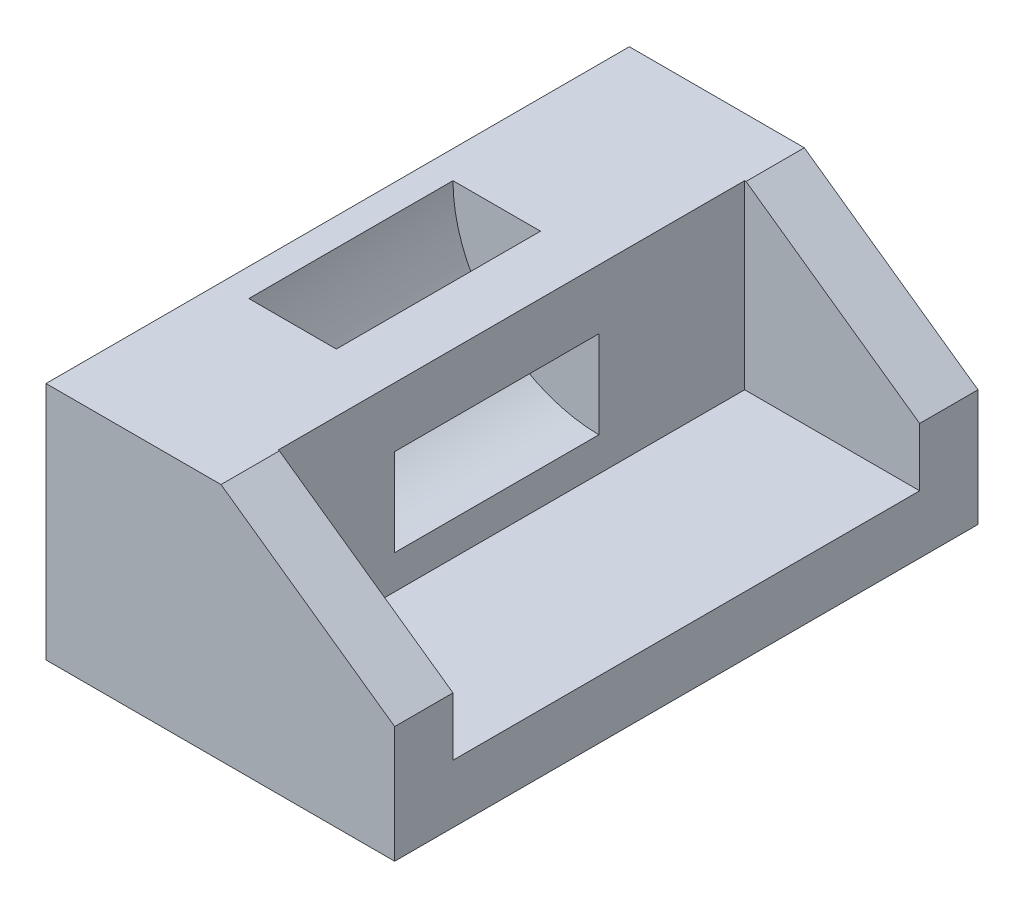
ISO-10303-21;
HEADER;
FILE_DESCRIPTION(('STEP AP214'),'2;1');
FILE_NAME('part.step','',(''),(''),'','','');
FILE_SCHEMA(('AUTOMOTIVE_DESIGN { 1 0 10303 214 1 1 1 1 }'));
ENDSEC;
DATA;
#1=APPLICATION_CONTEXT('core data for automotive mechanical design processes');
#2=APPLICATION_PROTOCOL_DEFINITION('international standard','automotive_design',2000,#1);
#3=PRODUCT_CONTEXT('',#1,'mechanical');
#4=PRODUCT('Part','Part','',(#3));
#5=PRODUCT_RELATED_PRODUCT_CATEGORY('part','',(#4));
#6=PRODUCT_DEFINITION_FORMATION('','',#4);
#7=PRODUCT_DEFINITION_CONTEXT('part definition',#1,'design');
#8=PRODUCT_DEFINITION('design','',#6,#7);
#9=PRODUCT_DEFINITION_SHAPE('','',#8);
#10=(LENGTH_UNIT() NAMED_UNIT(*) SI_UNIT(.MILLI.,.METRE.));
#11=(NAMED_UNIT(*) PLANE_ANGLE_UNIT() SI_UNIT($,.RADIAN.));
#12=(NAMED_UNIT(*) SI_UNIT($,.STERADIAN.) SOLID_ANGLE_UNIT());
#13=UNCERTAINTY_MEASURE_WITH_UNIT(LENGTH_MEASURE(1.E-05),#10,'distance_accuracy_value','');
#14=(GEOMETRIC_REPRESENTATION_CONTEXT(3) GLOBAL_UNCERTAINTY_ASSIGNED_CONTEXT((#13)) GLOBAL_UNIT_ASSIGNED_CONTEXT((#10,
#11,#12)) REPRESENTATION_CONTEXT('',''));
#15=CARTESIAN_POINT('',(0.,0.,0.));
#16=DIRECTION('',(0.,0.,1.));
#17=DIRECTION('',(1.,0.,0.));
#18=AXIS2_PLACEMENT_3D('',#15,#16,#17);
#19=CARTESIAN_POINT('',(0.,20.5223884413758,50.));
#20=DIRECTION('',(0.,-1.,0.));
#21=DIRECTION('',(0.,0.,-1.));
#22=AXIS2_PLACEMENT_3D('',#19,#20,#21);
#23=PLANE('',#22);
#24=DIRECTION('',(0.,0.,-1.));
#25=VECTOR('',#24,1.);
#26=CARTESIAN_POINT('',(15.,20.5223884413758,50.));
#27=LINE('',#26,#25);
#28=CARTESIAN_POINT('',(15.,20.5223884413758,50.));
#29=VERTEX_POINT('',#28);
#30=CARTESIAN_POINT('',(15.,20.5223884413758,45.));
#31=VERTEX_POINT('',#30);
#32=EDGE_CURVE('E260',#29,#31,#27,.T.);
#33=ORIENTED_EDGE('',*,*,#32,.T.);
#34=DIRECTION('',(1.,0.,0.));
#35=VECTOR('',#34,1.);
#36=CARTESIAN_POINT('',(14.8851370851371,20.5223884413758,45.));
#37=LINE('',#36,#35);
#38=CARTESIAN_POINT('',(14.8851370851371,20.5223884413758,45.));
#39=VERTEX_POINT('',#38);
#40=EDGE_CURVE('E196',#39,#31,#37,.T.);
#41=ORIENTED_EDGE('',*,*,#40,.F.);
#42=DIRECTION('',(0.,0.,1.));
#43=VECTOR('',#42,1.);
#44=CARTESIAN_POINT('',(14.8851370851371,20.5223884413758,45.));
#45=LINE('',#44,#43);
#46=CARTESIAN_POINT('',(14.8851370851371,20.5223884413758,5.));
#47=VERTEX_POINT('',#46);
#48=EDGE_CURVE('E183',#47,#39,#45,.T.);
#49=ORIENTED_EDGE('',*,*,#48,.F.);
#50=DIRECTION('',(1.,0.,0.));
#51=VECTOR('',#50,1.);
#52=CARTESIAN_POINT('',(14.8851370851371,20.5223884413758,5.));
#53=LINE('',#52,#51);
#54=CARTESIAN_POINT('',(15.,20.5223884413758,5.));
#55=VERTEX_POINT('',#54);
#56=EDGE_CURVE('E200',#47,#55,#53,.T.);
#57=ORIENTED_EDGE('',*,*,#56,.T.);
#58=CARTESIAN_POINT('',(15.,20.5223884413758,0.));
#59=VERTEX_POINT('',#58);
#60=EDGE_CURVE('E259',#55,#59,#27,.T.);
#61=ORIENTED_EDGE('',*,*,#60,.T.);
#62=DIRECTION('',(-1.,0.,0.));
#63=VECTOR('',#62,1.);
#64=CARTESIAN_POINT('',(0.,20.5223884413758,0.));
#65=LINE('',#64,#63);
#66=CARTESIAN_POINT('',(0.,20.5223884413758,0.));
#67=VERTEX_POINT('',#66);
#68=EDGE_CURVE('E247',#59,#67,#65,.T.);
#69=ORIENTED_EDGE('',*,*,#68,.T.);
#70=DIRECTION('',(0.,0.,-1.));
#71=VECTOR('',#70,1.);
#72=CARTESIAN_POINT('',(0.,20.5223884413758,50.));
#73=LINE('',#72,#71);
#74=CARTESIAN_POINT('',(0.,20.5223884413758,50.));
#75=VERTEX_POINT('',#74);
#76=EDGE_CURVE('E255',#75,#67,#73,.T.);
#77=ORIENTED_EDGE('',*,*,#76,.F.);
#78=DIRECTION('',(-1.,0.,0.));
#79=VECTOR('',#78,1.);
#80=CARTESIAN_POINT('',(0.,20.5223884413758,50.));
#81=LINE('',#80,#79);
#82=EDGE_CURVE('E229',#29,#75,#81,.T.);
#83=ORIENTED_EDGE('',*,*,#82,.F.);
#84=EDGE_LOOP('',(#33,#41,#49,#57,#61,#69,#77,#83));
#85=FACE_BOUND('',#84,.T.);
#86=DIRECTION('',(0.,0.,1.));
#87=VECTOR('',#86,1.);
#88=CARTESIAN_POINT('',(2.38513708513708,20.5223884413758,50.));
#89=LINE('',#88,#87);
#90=CARTESIAN_POINT('',(2.38513708513708,20.5223884413758,17.5));
#91=VERTEX_POINT('',#90);
#92=CARTESIAN_POINT('',(2.38513708513708,20.5223884413758,35.));
#93=VERTEX_POINT('',#92);
#94=EDGE_CURVE('E164',#91,#93,#89,.T.);
#95=ORIENTED_EDGE('',*,*,#94,.F.);
#96=DIRECTION('',(-1.,0.,0.));
#97=VECTOR('',#96,1.);
#98=CARTESIAN_POINT('',(0.,20.5223884413758,17.5));
#99=LINE('',#98,#97);
#100=CARTESIAN_POINT('',(9.88513708513708,20.5223884413758,17.5));
#101=VERTEX_POINT('',#100);
#102=EDGE_CURVE('E160',#101,#91,#99,.T.);
#103=ORIENTED_EDGE('',*,*,#102,.F.);
#104=DIRECTION('',(0.,0.,1.));
#105=VECTOR('',#104,1.);
#106=CARTESIAN_POINT('',(9.88513708513708,20.5223884413758,50.));
#107=LINE('',#106,#105);
#108=CARTESIAN_POINT('',(9.88513708513708,20.5223884413758,35.));
#109=VERTEX_POINT('',#108);
#110=EDGE_CURVE('E146',#109,#101,#107,.F.);
#111=ORIENTED_EDGE('',*,*,#110,.F.);
#112=DIRECTION('',(1.,0.,0.));
#113=VECTOR('',#112,1.);
#114=CARTESIAN_POINT('',(0.,20.5223884413758,35.));
#115=LINE('',#114,#113);
#116=EDGE_CURVE('E140',#93,#109,#115,.T.);
#117=ORIENTED_EDGE('',*,*,#116,.F.);
#118=EDGE_LOOP('',(#95,#103,#111,#117));
#119=FACE_BOUND('',#118,.T.);
#120=ADVANCED_FACE('F41',(#85,#119),#23,.F.);
#121=CARTESIAN_POINT('',(14.8851370851371,0.,0.));
#122=DIRECTION('',(1.,0.,0.));
#123=DIRECTION('',(0.,0.,-1.));
#124=AXIS2_PLACEMENT_3D('',#121,#122,#123);
#125=PLANE('',#124);
#126=DIRECTION('',(0.,-1.,0.));
#127=VECTOR('',#126,1.);
#128=CARTESIAN_POINT('',(14.8851370851371,20.5223884413758,45.));
#129=LINE('',#128,#127);
#130=CARTESIAN_POINT('',(14.8851370851371,5.,45.));
#131=VERTEX_POINT('',#130);
#132=EDGE_CURVE('E171',#39,#131,#129,.T.);
#133=ORIENTED_EDGE('',*,*,#132,.T.);
#134=DIRECTION('',(0.,0.,-1.));
#135=VECTOR('',#134,1.);
#136=CARTESIAN_POINT('',(14.8851370851371,5.,45.));
#137=LINE('',#136,#135);
#138=CARTESIAN_POINT('',(14.8851370851371,5.,5.));
#139=VERTEX_POINT('',#138);
#140=EDGE_CURVE('E175',#131,#139,#137,.T.);
#141=ORIENTED_EDGE('',*,*,#140,.T.);
#142=DIRECTION('',(0.,1.,0.));
#143=VECTOR('',#142,1.);
#144=CARTESIAN_POINT('',(14.8851370851371,20.5223884413758,5.));
#145=LINE('',#144,#143);
#146=EDGE_CURVE('E180',#139,#47,#145,.T.);
#147=ORIENTED_EDGE('',*,*,#146,.T.);
#148=ORIENTED_EDGE('',*,*,#48,.T.);
#149=EDGE_LOOP('',(#133,#141,#147,#148));
#150=FACE_BOUND('',#149,.T.);
#151=DIRECTION('',(0.,-1.,0.));
#152=VECTOR('',#151,1.);
#153=CARTESIAN_POINT('',(14.8851370851371,0.,17.5));
#154=LINE('',#153,#152);
#155=CARTESIAN_POINT('',(14.8851370851371,15.4088154098616,17.5));
#156=VERTEX_POINT('',#155);
#157=CARTESIAN_POINT('',(14.8851370851371,7.90804847165985,17.5));
#158=VERTEX_POINT('',#157);
#159=EDGE_CURVE('E50',#156,#158,#154,.T.);
#160=ORIENTED_EDGE('',*,*,#159,.T.);
#161=DIRECTION('',(0.,0.,1.));
#162=VECTOR('',#161,1.);
#163=CARTESIAN_POINT('',(14.8851370851371,7.90804847165985,50.));
#164=LINE('',#163,#162);
#165=CARTESIAN_POINT('',(14.8851370851371,7.90804847165985,35.));
#166=VERTEX_POINT('',#165);
#167=EDGE_CURVE('E11',#158,#166,#164,.T.);
#168=ORIENTED_EDGE('',*,*,#167,.T.);
#169=DIRECTION('',(0.,1.,0.));
#170=VECTOR('',#169,1.);
#171=CARTESIAN_POINT('',(14.8851370851371,0.,35.));
#172=LINE('',#171,#170);
#173=CARTESIAN_POINT('',(14.8851370851371,15.4088154098616,35.));
#174=VERTEX_POINT('',#173);
#175=EDGE_CURVE('E273',#166,#174,#172,.T.);
#176=ORIENTED_EDGE('',*,*,#175,.T.);
#177=DIRECTION('',(0.,0.,1.));
#178=VECTOR('',#177,1.);
#179=CARTESIAN_POINT('',(14.8851370851371,15.4088154098616,50.));
#180=LINE('',#179,#178);
#181=EDGE_CURVE('E154',#174,#156,#180,.F.);
#182=ORIENTED_EDGE('',*,*,#181,.T.);
#183=EDGE_LOOP('',(#160,#168,#176,#182));
#184=FACE_BOUND('',#183,.T.);
#185=ADVANCED_FACE('F280',(#150,#184),#125,.T.);
#186=CARTESIAN_POINT('',(29.8851370851371,10.,50.));
#187=DIRECTION('',(-0.577240805863913,-0.8165739721823,0.));
#188=DIRECTION('',(0.8165739721823,-0.577240805863913,0.));
#189=AXIS2_PLACEMENT_3D('',#186,#187,#188);
#190=PLANE('',#189);
#191=DIRECTION('',(0.,0.,-1.));
#192=VECTOR('',#191,1.);
#193=CARTESIAN_POINT('',(29.8851370851371,10.,50.));
#194=LINE('',#193,#192);
#195=CARTESIAN_POINT('',(29.8851370851371,10.,50.));
#196=VERTEX_POINT('',#195);
#197=CARTESIAN_POINT('',(29.8851370851371,10.,45.));
#198=VERTEX_POINT('',#197);
#199=EDGE_CURVE('E265',#196,#198,#194,.T.);
#200=ORIENTED_EDGE('',*,*,#199,.T.);
#201=DIRECTION('',(-0.8165739721823,0.577240805863913,0.));
#202=VECTOR('',#201,1.);
#203=CARTESIAN_POINT('',(29.8851370851371,10.,45.));
#204=LINE('',#203,#202);
#205=EDGE_CURVE('E213',#198,#31,#204,.T.);
#206=ORIENTED_EDGE('',*,*,#205,.T.);
#207=ORIENTED_EDGE('',*,*,#32,.F.);
#208=DIRECTION('',(-0.8165739721823,0.577240805863913,0.));
#209=VECTOR('',#208,1.);
#210=CARTESIAN_POINT('',(29.8851370851371,10.,50.));
#211=LINE('',#210,#209);
#212=EDGE_CURVE('E226',#196,#29,#211,.T.);
#213=ORIENTED_EDGE('',*,*,#212,.F.);
#214=EDGE_LOOP('',(#200,#206,#207,#213));
#215=FACE_BOUND('',#214,.T.);
#216=ADVANCED_FACE('F310',(#215),#190,.F.);
#217=CARTESIAN_POINT('',(0.,0.,50.));
#218=DIRECTION('',(0.,1.,0.));
#219=DIRECTION('',(0.,0.,1.));
#220=AXIS2_PLACEMENT_3D('',#217,#218,#219);
#221=PLANE('',#220);
#222=DIRECTION('',(1.,0.,0.));
#223=VECTOR('',#222,1.);
#224=CARTESIAN_POINT('',(0.,0.,0.));
#225=LINE('',#224,#223);
#226=CARTESIAN_POINT('',(0.,0.,0.));
#227=VERTEX_POINT('',#226);
#228=CARTESIAN_POINT('',(29.8851370851371,0.,0.));
#229=VERTEX_POINT('',#228);
#230=EDGE_CURVE('E217',#227,#229,#225,.T.);
#231=ORIENTED_EDGE('',*,*,#230,.T.);
#232=DIRECTION('',(0.,0.,-1.));
#233=VECTOR('',#232,1.);
#234=CARTESIAN_POINT('',(29.8851370851371,0.,50.));
#235=LINE('',#234,#233);
#236=CARTESIAN_POINT('',(29.8851370851371,0.,50.));
#237=VERTEX_POINT('',#236);
#238=EDGE_CURVE('E269',#237,#229,#235,.T.);
#239=ORIENTED_EDGE('',*,*,#238,.F.);
#240=DIRECTION('',(1.,0.,0.));
#241=VECTOR('',#240,1.);
#242=CARTESIAN_POINT('',(0.,0.,50.));
#243=LINE('',#242,#241);
#244=CARTESIAN_POINT('',(0.,0.,50.));
#245=VERTEX_POINT('',#244);
#246=EDGE_CURVE('E218',#245,#237,#243,.T.);
#247=ORIENTED_EDGE('',*,*,#246,.F.);
#248=DIRECTION('',(0.,0.,-1.));
#249=VECTOR('',#248,1.);
#250=CARTESIAN_POINT('',(0.,0.,50.));
#251=LINE('',#250,#249);
#252=EDGE_CURVE('E235',#245,#227,#251,.T.);
#253=ORIENTED_EDGE('',*,*,#252,.T.);
#254=EDGE_LOOP('',(#231,#239,#247,#253));
#255=FACE_BOUND('',#254,.T.);
#256=ADVANCED_FACE('F43',(#255),#221,.F.);
#257=CARTESIAN_POINT('',(29.8851370851371,0.,50.));
#258=DIRECTION('',(-1.,0.,0.));
#259=DIRECTION('',(0.,0.,1.));
#260=AXIS2_PLACEMENT_3D('',#257,#258,#259);
#261=PLANE('',#260);
#262=DIRECTION('',(0.,0.,-1.));
#263=VECTOR('',#262,1.);
#264=CARTESIAN_POINT('',(29.8851370851371,5.,45.));
#265=LINE('',#264,#263);
#266=CARTESIAN_POINT('',(29.8851370851371,5.,45.));
#267=VERTEX_POINT('',#266);
#268=CARTESIAN_POINT('',(29.8851370851371,5.,5.));
#269=VERTEX_POINT('',#268);
#270=EDGE_CURVE('E190',#267,#269,#265,.T.);
#271=ORIENTED_EDGE('',*,*,#270,.F.);
#272=DIRECTION('',(0.,-1.,0.));
#273=VECTOR('',#272,1.);
#274=CARTESIAN_POINT('',(29.8851370851371,20.5223884413758,45.));
#275=LINE('',#274,#273);
#276=EDGE_CURVE('E170',#198,#267,#275,.T.);
#277=ORIENTED_EDGE('',*,*,#276,.F.);
#278=ORIENTED_EDGE('',*,*,#199,.F.);
#279=DIRECTION('',(0.,1.,0.));
#280=VECTOR('',#279,1.);
#281=CARTESIAN_POINT('',(29.8851370851371,0.,50.));
#282=LINE('',#281,#280);
#283=EDGE_CURVE('E222',#237,#196,#282,.T.);
#284=ORIENTED_EDGE('',*,*,#283,.F.);
#285=ORIENTED_EDGE('',*,*,#238,.T.);
#286=DIRECTION('',(0.,1.,0.));
#287=VECTOR('',#286,1.);
#288=CARTESIAN_POINT('',(29.8851370851371,0.,0.));
#289=LINE('',#288,#287);
#290=CARTESIAN_POINT('',(29.8851370851371,10.,0.));
#291=VERTEX_POINT('',#290);
#292=EDGE_CURVE('E239',#229,#291,#289,.T.);
#293=ORIENTED_EDGE('',*,*,#292,.T.);
#294=CARTESIAN_POINT('',(29.8851370851371,10.,5.));
#295=VERTEX_POINT('',#294);
#296=EDGE_CURVE('E264',#295,#291,#194,.T.);
#297=ORIENTED_EDGE('',*,*,#296,.F.);
#298=DIRECTION('',(0.,1.,0.));
#299=VECTOR('',#298,1.);
#300=CARTESIAN_POINT('',(29.8851370851371,20.5223884413758,5.));
#301=LINE('',#300,#299);
#302=EDGE_CURVE('E176',#269,#295,#301,.T.);
#303=ORIENTED_EDGE('',*,*,#302,.F.);
#304=EDGE_LOOP('',(#271,#277,#278,#284,#285,#293,#297,#303));
#305=FACE_BOUND('',#304,.T.);
#306=ADVANCED_FACE('F318',(#305),#261,.F.);
#307=ORIENTED_EDGE('',*,*,#60,.F.);
#308=DIRECTION('',(0.8165739721823,-0.577240805863913,0.));
#309=VECTOR('',#308,1.);
#310=CARTESIAN_POINT('',(29.8851370851371,10.,5.));
#311=LINE('',#310,#309);
#312=EDGE_CURVE('E199',#55,#295,#311,.T.);
#313=ORIENTED_EDGE('',*,*,#312,.T.);
#314=ORIENTED_EDGE('',*,*,#296,.T.);
#315=DIRECTION('',(-0.8165739721823,0.577240805863913,0.));
#316=VECTOR('',#315,1.);
#317=CARTESIAN_POINT('',(29.8851370851371,10.,0.));
#318=LINE('',#317,#316);
#319=EDGE_CURVE('E243',#291,#59,#318,.T.);
#320=ORIENTED_EDGE('',*,*,#319,.T.);
#321=EDGE_LOOP('',(#307,#313,#314,#320));
#322=FACE_BOUND('',#321,.T.);
#323=ADVANCED_FACE('F316',(#322),#190,.F.);
#324=CARTESIAN_POINT('',(0.,0.,50.));
#325=DIRECTION('',(1.,0.,0.));
#326=DIRECTION('',(0.,0.,-1.));
#327=AXIS2_PLACEMENT_3D('',#324,#325,#326);
#328=PLANE('',#327);
#329=DIRECTION('',(0.,-1.,0.));
#330=VECTOR('',#329,1.);
#331=CARTESIAN_POINT('',(0.,0.,0.));
#332=LINE('',#331,#330);
#333=EDGE_CURVE('E223',#67,#227,#332,.T.);
#334=ORIENTED_EDGE('',*,*,#333,.T.);
#335=ORIENTED_EDGE('',*,*,#252,.F.);
#336=DIRECTION('',(0.,-1.,0.));
#337=VECTOR('',#336,1.);
#338=CARTESIAN_POINT('',(0.,0.,50.));
#339=LINE('',#338,#337);
#340=EDGE_CURVE('E232',#75,#245,#339,.T.);
#341=ORIENTED_EDGE('',*,*,#340,.F.);
#342=ORIENTED_EDGE('',*,*,#76,.T.);
#343=EDGE_LOOP('',(#334,#335,#341,#342));
#344=FACE_BOUND('',#343,.T.);
#345=ADVANCED_FACE('F314',(#344),#328,.F.);
#346=CARTESIAN_POINT('',(0.,0.,50.));
#347=DIRECTION('',(0.,0.,1.));
#348=DIRECTION('',(1.,0.,0.));
#349=AXIS2_PLACEMENT_3D('',#346,#347,#348);
#350=PLANE('',#349);
#351=ORIENTED_EDGE('',*,*,#246,.T.);
#352=ORIENTED_EDGE('',*,*,#283,.T.);
#353=ORIENTED_EDGE('',*,*,#212,.T.);
#354=ORIENTED_EDGE('',*,*,#82,.T.);
#355=ORIENTED_EDGE('',*,*,#340,.T.);
#356=EDGE_LOOP('',(#351,#352,#353,#354,#355));
#357=FACE_BOUND('',#356,.T.);
#358=ADVANCED_FACE('F344',(#357),#350,.T.);
#359=CARTESIAN_POINT('',(0.,0.,0.));
#360=DIRECTION('',(0.,0.,1.));
#361=DIRECTION('',(1.,0.,0.));
#362=AXIS2_PLACEMENT_3D('',#359,#360,#361);
#363=PLANE('',#362);
#364=ORIENTED_EDGE('',*,*,#230,.F.);
#365=ORIENTED_EDGE('',*,*,#333,.F.);
#366=ORIENTED_EDGE('',*,*,#68,.F.);
#367=ORIENTED_EDGE('',*,*,#319,.F.);
#368=ORIENTED_EDGE('',*,*,#292,.F.);
#369=EDGE_LOOP('',(#364,#365,#366,#367,#368));
#370=FACE_BOUND('',#369,.T.);
#371=ADVANCED_FACE('F352',(#370),#363,.F.);
#372=CARTESIAN_POINT('',(14.8851370851371,20.5223884413758,45.));
#373=DIRECTION('',(0.,0.,1.));
#374=DIRECTION('',(1.,0.,0.));
#375=AXIS2_PLACEMENT_3D('',#372,#373,#374);
#376=PLANE('',#375);
#377=ORIENTED_EDGE('',*,*,#276,.T.);
#378=DIRECTION('',(1.,0.,0.));
#379=VECTOR('',#378,1.);
#380=CARTESIAN_POINT('',(14.8851370851371,5.,45.));
#381=LINE('',#380,#379);
#382=EDGE_CURVE('E187',#131,#267,#381,.T.);
#383=ORIENTED_EDGE('',*,*,#382,.F.);
#384=ORIENTED_EDGE('',*,*,#132,.F.);
#385=ORIENTED_EDGE('',*,*,#40,.T.);
#386=ORIENTED_EDGE('',*,*,#205,.F.);
#387=EDGE_LOOP('',(#377,#383,#384,#385,#386));
#388=FACE_BOUND('',#387,.T.);
#389=ADVANCED_FACE('F334',(#388),#376,.F.);
#390=CARTESIAN_POINT('',(14.8851370851371,20.5223884413758,5.));
#391=DIRECTION('',(0.,0.,-1.));
#392=DIRECTION('',(-1.,0.,0.));
#393=AXIS2_PLACEMENT_3D('',#390,#391,#392);
#394=PLANE('',#393);
#395=ORIENTED_EDGE('',*,*,#56,.F.);
#396=ORIENTED_EDGE('',*,*,#146,.F.);
#397=DIRECTION('',(1.,0.,0.));
#398=VECTOR('',#397,1.);
#399=CARTESIAN_POINT('',(14.8851370851371,5.,5.));
#400=LINE('',#399,#398);
#401=EDGE_CURVE('E204',#139,#269,#400,.T.);
#402=ORIENTED_EDGE('',*,*,#401,.T.);
#403=ORIENTED_EDGE('',*,*,#302,.T.);
#404=ORIENTED_EDGE('',*,*,#312,.F.);
#405=EDGE_LOOP('',(#395,#396,#402,#403,#404));
#406=FACE_BOUND('',#405,.T.);
#407=ADVANCED_FACE('F300',(#406),#394,.F.);
#408=CARTESIAN_POINT('',(14.8851370851371,5.,45.));
#409=DIRECTION('',(0.,-1.,0.));
#410=DIRECTION('',(0.,0.,-1.));
#411=AXIS2_PLACEMENT_3D('',#408,#409,#410);
#412=PLANE('',#411);
#413=ORIENTED_EDGE('',*,*,#270,.T.);
#414=ORIENTED_EDGE('',*,*,#401,.F.);
#415=ORIENTED_EDGE('',*,*,#140,.F.);
#416=ORIENTED_EDGE('',*,*,#382,.T.);
#417=EDGE_LOOP('',(#413,#414,#415,#416));
#418=FACE_BOUND('',#417,.T.);
#419=ADVANCED_FACE('F293',(#418),#412,.F.);
#420=CARTESIAN_POINT('',(15.,20.5223884413758,50.));
#421=DIRECTION('',(0.,0.,1.));
#422=DIRECTION('',(1.,0.,0.));
#423=AXIS2_PLACEMENT_3D('',#420,#421,#422);
#424=CYLINDRICAL_SURFACE('',#423,12.6148629148629);
#425=ORIENTED_EDGE('',*,*,#94,.T.);
#426=CARTESIAN_POINT('',(15.,20.5223884413758,35.));
#427=DIRECTION('',(0.,0.,1.));
#428=DIRECTION('',(1.,0.,0.));
#429=AXIS2_PLACEMENT_3D('',#426,#427,#428);
#430=CIRCLE('',#429,12.6148629148629);
#431=EDGE_CURVE('E57',#93,#166,#430,.T.);
#432=ORIENTED_EDGE('',*,*,#431,.T.);
#433=ORIENTED_EDGE('',*,*,#167,.F.);
#434=CARTESIAN_POINT('',(15.,20.5223884413758,17.5));
#435=DIRECTION('',(0.,0.,1.));
#436=DIRECTION('',(1.,0.,0.));
#437=AXIS2_PLACEMENT_3D('',#434,#435,#436);
#438=CIRCLE('',#437,12.6148629148629);
#439=EDGE_CURVE('E147',#91,#158,#438,.T.);
#440=ORIENTED_EDGE('',*,*,#439,.F.);
#441=EDGE_LOOP('',(#425,#432,#433,#440));
#442=FACE_BOUND('',#441,.T.);
#443=ADVANCED_FACE('F291',(#442),#424,.F.);
#444=CARTESIAN_POINT('',(2.38513708513708,20.5223884413758,17.5));
#445=DIRECTION('',(0.,0.,1.));
#446=DIRECTION('',(1.,0.,0.));
#447=AXIS2_PLACEMENT_3D('',#444,#445,#446);
#448=PLANE('',#447);
#449=ORIENTED_EDGE('',*,*,#102,.T.);
#450=ORIENTED_EDGE('',*,*,#439,.T.);
#451=ORIENTED_EDGE('',*,*,#159,.F.);
#452=CARTESIAN_POINT('',(15.,20.5223884413758,17.5));
#453=DIRECTION('',(0.,0.,1.));
#454=DIRECTION('',(1.,0.,0.));
#455=AXIS2_PLACEMENT_3D('',#452,#453,#454);
#456=CIRCLE('',#455,5.11486291486292);
#457=EDGE_CURVE('E157',#101,#156,#456,.T.);
#458=ORIENTED_EDGE('',*,*,#457,.F.);
#459=EDGE_LOOP('',(#449,#450,#451,#458));
#460=FACE_BOUND('',#459,.T.);
#461=ADVANCED_FACE('F283',(#460),#448,.T.);
#462=CARTESIAN_POINT('',(15.,20.5223884413758,50.));
#463=DIRECTION('',(0.,0.,1.));
#464=DIRECTION('',(1.,0.,0.));
#465=AXIS2_PLACEMENT_3D('',#462,#463,#464);
#466=CYLINDRICAL_SURFACE('',#465,5.11486291486292);
#467=ORIENTED_EDGE('',*,*,#110,.T.);
#468=ORIENTED_EDGE('',*,*,#457,.T.);
#469=ORIENTED_EDGE('',*,*,#181,.F.);
#470=CARTESIAN_POINT('',(15.,20.5223884413758,35.));
#471=DIRECTION('',(0.,0.,1.));
#472=DIRECTION('',(1.,0.,0.));
#473=AXIS2_PLACEMENT_3D('',#470,#471,#472);
#474=CIRCLE('',#473,5.11486291486292);
#475=EDGE_CURVE('E62',#109,#174,#474,.T.);
#476=ORIENTED_EDGE('',*,*,#475,.F.);
#477=EDGE_LOOP('',(#467,#468,#469,#476));
#478=FACE_BOUND('',#477,.T.);
#479=ADVANCED_FACE('F150',(#478),#466,.T.);
#480=CARTESIAN_POINT('',(2.38513708513708,20.5223884413758,35.));
#481=DIRECTION('',(0.,0.,-1.));
#482=DIRECTION('',(-1.,0.,0.));
#483=AXIS2_PLACEMENT_3D('',#480,#481,#482);
#484=PLANE('',#483);
#485=ORIENTED_EDGE('',*,*,#116,.T.);
#486=ORIENTED_EDGE('',*,*,#475,.T.);
#487=ORIENTED_EDGE('',*,*,#175,.F.);
#488=ORIENTED_EDGE('',*,*,#431,.F.);
#489=EDGE_LOOP('',(#485,#486,#487,#488));
#490=FACE_BOUND('',#489,.T.);
#491=ADVANCED_FACE('F141',(#490),#484,.T.);
#492=CLOSED_SHELL('',(#120,#185,#216,#256,#306,#323,#345,#358,#371,#389,#407,#419,#443,#461,
#479,#491));
#493=MANIFOLD_SOLID_BREP('B2',#492);
#494=ADVANCED_BREP_SHAPE_REPRESENTATION('',(#18,#493),#14);
#495=SHAPE_DEFINITION_REPRESENTATION(#9,#494);
ENDSEC;
END-ISO-10303-21;
